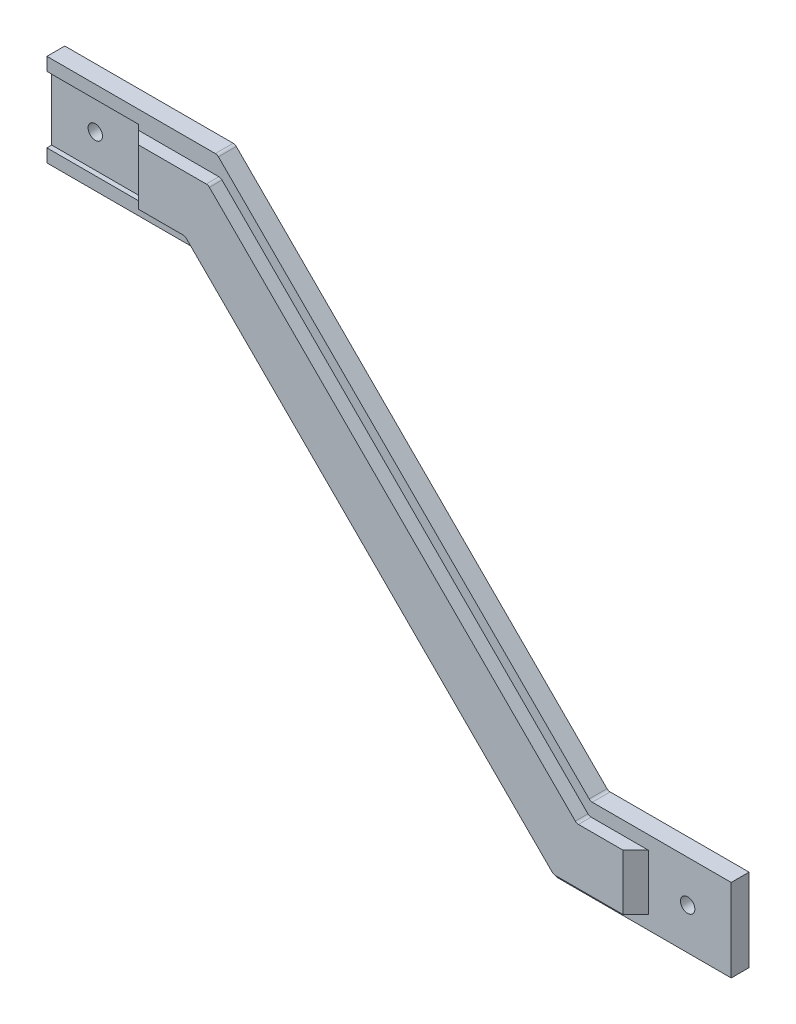
ISO-10303-21;
HEADER;
FILE_DESCRIPTION(('STEP AP214'),'2;1');
FILE_NAME('part.step','',(''),(''),'','','');
FILE_SCHEMA(('AUTOMOTIVE_DESIGN { 1 0 10303 214 1 1 1 1 }'));
ENDSEC;
DATA;
#1=APPLICATION_CONTEXT('core data for automotive mechanical design processes');
#2=APPLICATION_PROTOCOL_DEFINITION('international standard','automotive_design',2000,#1);
#3=PRODUCT_CONTEXT('',#1,'mechanical');
#4=PRODUCT('Part','Part','',(#3));
#5=PRODUCT_RELATED_PRODUCT_CATEGORY('part','',(#4));
#6=PRODUCT_DEFINITION_FORMATION('','',#4);
#7=PRODUCT_DEFINITION_CONTEXT('part definition',#1,'design');
#8=PRODUCT_DEFINITION('design','',#6,#7);
#9=PRODUCT_DEFINITION_SHAPE('','',#8);
#10=(LENGTH_UNIT() NAMED_UNIT(*) SI_UNIT(.MILLI.,.METRE.));
#11=(NAMED_UNIT(*) PLANE_ANGLE_UNIT() SI_UNIT($,.RADIAN.));
#12=(NAMED_UNIT(*) SI_UNIT($,.STERADIAN.) SOLID_ANGLE_UNIT());
#13=UNCERTAINTY_MEASURE_WITH_UNIT(LENGTH_MEASURE(1.E-05),#10,'distance_accuracy_value','');
#14=(GEOMETRIC_REPRESENTATION_CONTEXT(3) GLOBAL_UNCERTAINTY_ASSIGNED_CONTEXT((#13)) GLOBAL_UNIT_ASSIGNED_CONTEXT((#10,
#11,#12)) REPRESENTATION_CONTEXT('',''));
#15=CARTESIAN_POINT('',(0.,0.,0.));
#16=DIRECTION('',(0.,0.,1.));
#17=DIRECTION('',(1.,0.,0.));
#18=AXIS2_PLACEMENT_3D('',#15,#16,#17);
#19=CARTESIAN_POINT('',(-68.55,42.3,3.));
#20=DIRECTION('',(0.,0.,-1.));
#21=DIRECTION('',(-1.,0.,0.));
#22=AXIS2_PLACEMENT_3D('',#19,#20,#21);
#23=CYLINDRICAL_SURFACE('',#22,1.65);
#24=CARTESIAN_POINT('',(-68.55,42.3,-1.1));
#25=DIRECTION('',(0.,0.,1.));
#26=DIRECTION('',(1.,0.,0.));
#27=AXIS2_PLACEMENT_3D('',#24,#25,#26);
#28=CIRCLE('',#27,1.65);
#29=CARTESIAN_POINT('',(-66.9,42.3,-1.1));
#30=VERTEX_POINT('',#29);
#31=EDGE_CURVE('E266',#30,#30,#28,.T.);
#32=ORIENTED_EDGE('',*,*,#31,.F.);
#33=EDGE_LOOP('',(#32));
#34=FACE_BOUND('',#33,.T.);
#35=CARTESIAN_POINT('',(-68.55,42.3,1.9));
#36=DIRECTION('',(0.,0.,1.));
#37=DIRECTION('',(1.,0.,0.));
#38=AXIS2_PLACEMENT_3D('',#35,#36,#37);
#39=CIRCLE('',#38,1.65);
#40=CARTESIAN_POINT('',(-66.9,42.3,1.9));
#41=VERTEX_POINT('',#40);
#42=EDGE_CURVE('E259',#41,#41,#39,.T.);
#43=ORIENTED_EDGE('',*,*,#42,.T.);
#44=EDGE_LOOP('',(#43));
#45=FACE_BOUND('',#44,.T.);
#46=ADVANCED_FACE('F36',(#34,#45),#23,.F.);
#47=CARTESIAN_POINT('',(0.,0.,3.));
#48=DIRECTION('',(0.,0.,-1.));
#49=DIRECTION('',(-1.,0.,0.));
#50=AXIS2_PLACEMENT_3D('',#47,#48,#49);
#51=PLANE('',#50);
#52=CARTESIAN_POINT('',(68.55,-42.3,3.));
#53=DIRECTION('',(0.,0.,1.));
#54=DIRECTION('',(1.,0.,0.));
#55=AXIS2_PLACEMENT_3D('',#52,#53,#54);
#56=CIRCLE('',#55,1.65);
#57=CARTESIAN_POINT('',(70.2,-42.3,3.));
#58=VERTEX_POINT('',#57);
#59=EDGE_CURVE('E318',#58,#58,#56,.T.);
#60=ORIENTED_EDGE('',*,*,#59,.F.);
#61=EDGE_LOOP('',(#60));
#62=FACE_BOUND('',#61,.T.);
#63=DIRECTION('',(-0.707106781186546,0.707106781186549,0.));
#64=VECTOR('',#63,1.);
#65=CARTESIAN_POINT('',(-38.3649711574555,51.8,3.));
#66=LINE('',#65,#64);
#67=CARTESIAN_POINT('',(45.9421356237309,-32.5071067811866,3.));
#68=VERTEX_POINT('',#67);
#69=CARTESIAN_POINT('',(-39.1720779386421,52.6071067811866,3.));
#70=VERTEX_POINT('',#69);
#71=EDGE_CURVE('E354',#68,#70,#66,.T.);
#72=ORIENTED_EDGE('',*,*,#71,.T.);
#73=CARTESIAN_POINT('',(-39.8791847198286,51.9,3.));
#74=DIRECTION('',(0.,0.,-1.));
#75=DIRECTION('',(-1.,0.,0.));
#76=AXIS2_PLACEMENT_3D('',#73,#74,#75);
#77=CIRCLE('',#76,1.);
#78=CARTESIAN_POINT('',(-39.8791847198286,52.9,3.));
#79=VERTEX_POINT('',#78);
#80=EDGE_CURVE('E405',#70,#79,#77,.F.);
#81=ORIENTED_EDGE('',*,*,#80,.T.);
#82=DIRECTION('',(-1.,0.,0.));
#83=VECTOR('',#82,1.);
#84=CARTESIAN_POINT('',(-39.4649711574558,52.9,3.));
#85=LINE('',#84,#83);
#86=CARTESIAN_POINT('',(-78.55,52.9,3.));
#87=VERTEX_POINT('',#86);
#88=EDGE_CURVE('E269',#79,#87,#85,.T.);
#89=ORIENTED_EDGE('',*,*,#88,.T.);
#90=DIRECTION('',(0.,-1.,0.));
#91=VECTOR('',#90,1.);
#92=CARTESIAN_POINT('',(-78.55,32.8,3.));
#93=LINE('',#92,#91);
#94=CARTESIAN_POINT('',(-78.55,49.9,3.));
#95=VERTEX_POINT('',#94);
#96=EDGE_CURVE('E342',#87,#95,#93,.T.);
#97=ORIENTED_EDGE('',*,*,#96,.T.);
#98=DIRECTION('',(-1.,0.,0.));
#99=VECTOR('',#98,1.);
#100=CARTESIAN_POINT('',(-57.55,49.9,3.));
#101=LINE('',#100,#99);
#102=CARTESIAN_POINT('',(-57.55,49.9,3.));
#103=VERTEX_POINT('',#102);
#104=EDGE_CURVE('E227',#103,#95,#101,.T.);
#105=ORIENTED_EDGE('',*,*,#104,.F.);
#106=DIRECTION('',(0.,1.,0.));
#107=VECTOR('',#106,1.);
#108=CARTESIAN_POINT('',(-57.55,34.7,3.));
#109=LINE('',#108,#107);
#110=CARTESIAN_POINT('',(-57.55,48.7,3.));
#111=VERTEX_POINT('',#110);
#112=EDGE_CURVE('E255',#111,#103,#109,.T.);
#113=ORIENTED_EDGE('',*,*,#112,.F.);
#114=DIRECTION('',(-1.,0.,0.));
#115=VECTOR('',#114,1.);
#116=CARTESIAN_POINT('',(-38.6490332008122,48.7,3.));
#117=LINE('',#116,#115);
#118=CARTESIAN_POINT('',(-39.0632467631852,48.7,3.));
#119=VERTEX_POINT('',#118);
#120=EDGE_CURVE('E298',#119,#111,#117,.T.);
#121=ORIENTED_EDGE('',*,*,#120,.F.);
#122=CARTESIAN_POINT('',(-39.0632467631852,47.7,3.));
#123=DIRECTION('',(0.,0.,-1.));
#124=DIRECTION('',(-1.,0.,0.));
#125=AXIS2_PLACEMENT_3D('',#122,#123,#124);
#126=CIRCLE('',#125,1.);
#127=CARTESIAN_POINT('',(-38.3561399819987,48.4071067811866,3.));
#128=VERTEX_POINT('',#127);
#129=EDGE_CURVE('E436',#119,#128,#126,.T.);
#130=ORIENTED_EDGE('',*,*,#129,.T.);
#131=DIRECTION('',(-0.707106781186548,0.707106781186548,0.));
#132=VECTOR('',#131,1.);
#133=CARTESIAN_POINT('',(45.9509667991878,-35.9,3.));
#134=LINE('',#133,#132);
#135=CARTESIAN_POINT('',(45.6580735803744,-35.6071067811865,3.));
#136=VERTEX_POINT('',#135);
#137=EDGE_CURVE('E304',#136,#128,#134,.T.);
#138=ORIENTED_EDGE('',*,*,#137,.F.);
#139=CARTESIAN_POINT('',(46.3651803615609,-34.9,3.));
#140=DIRECTION('',(0.,0.,-1.));
#141=DIRECTION('',(-1.,0.,0.));
#142=AXIS2_PLACEMENT_3D('',#139,#140,#141);
#143=CIRCLE('',#142,1.);
#144=CARTESIAN_POINT('',(46.3651803615609,-35.9,3.));
#145=VERTEX_POINT('',#144);
#146=EDGE_CURVE('E403',#136,#145,#143,.F.);
#147=ORIENTED_EDGE('',*,*,#146,.T.);
#148=DIRECTION('',(-1.,0.,0.));
#149=VECTOR('',#148,1.);
#150=CARTESIAN_POINT('',(59.55,-35.9,3.));
#151=LINE('',#150,#149);
#152=CARTESIAN_POINT('',(59.55,-35.9,3.));
#153=VERTEX_POINT('',#152);
#154=EDGE_CURVE('E334',#153,#145,#151,.T.);
#155=ORIENTED_EDGE('',*,*,#154,.F.);
#156=DIRECTION('',(0.,1.,0.));
#157=VECTOR('',#156,1.);
#158=CARTESIAN_POINT('',(59.55,-48.7,3.));
#159=LINE('',#158,#157);
#160=CARTESIAN_POINT('',(59.55,-48.7,3.));
#161=VERTEX_POINT('',#160);
#162=EDGE_CURVE('E331',#161,#153,#159,.T.);
#163=ORIENTED_EDGE('',*,*,#162,.F.);
#164=DIRECTION('',(1.,0.,0.));
#165=VECTOR('',#164,1.);
#166=CARTESIAN_POINT('',(40.6490332008122,-48.7,3.));
#167=LINE('',#166,#165);
#168=CARTESIAN_POINT('',(41.0632467631853,-48.7,3.));
#169=VERTEX_POINT('',#168);
#170=EDGE_CURVE('E329',#169,#161,#167,.T.);
#171=ORIENTED_EDGE('',*,*,#170,.F.);
#172=CARTESIAN_POINT('',(41.0632467631853,-47.7,3.));
#173=DIRECTION('',(0.,0.,-1.));
#174=DIRECTION('',(-1.,0.,0.));
#175=AXIS2_PLACEMENT_3D('',#172,#173,#174);
#176=CIRCLE('',#175,1.);
#177=CARTESIAN_POINT('',(40.3561399819987,-48.4071067811865,3.));
#178=VERTEX_POINT('',#177);
#179=EDGE_CURVE('E444',#169,#178,#176,.T.);
#180=ORIENTED_EDGE('',*,*,#179,.T.);
#181=DIRECTION('',(0.707106781186547,-0.707106781186548,0.));
#182=VECTOR('',#181,1.);
#183=CARTESIAN_POINT('',(-43.9509667991878,35.9,3.));
#184=LINE('',#183,#182);
#185=CARTESIAN_POINT('',(-43.6580735803743,35.6071067811866,3.));
#186=VERTEX_POINT('',#185);
#187=EDGE_CURVE('E326',#186,#178,#184,.T.);
#188=ORIENTED_EDGE('',*,*,#187,.F.);
#189=CARTESIAN_POINT('',(-44.3651803615609,34.9,3.));
#190=DIRECTION('',(0.,0.,-1.));
#191=DIRECTION('',(-1.,0.,0.));
#192=AXIS2_PLACEMENT_3D('',#189,#190,#191);
#193=CIRCLE('',#192,1.);
#194=CARTESIAN_POINT('',(-44.3651803615609,35.9,3.));
#195=VERTEX_POINT('',#194);
#196=EDGE_CURVE('E399',#186,#195,#193,.F.);
#197=ORIENTED_EDGE('',*,*,#196,.T.);
#198=DIRECTION('',(1.,0.,0.));
#199=VECTOR('',#198,1.);
#200=CARTESIAN_POINT('',(-57.55,35.9,3.));
#201=LINE('',#200,#199);
#202=CARTESIAN_POINT('',(-57.55,35.9,3.));
#203=VERTEX_POINT('',#202);
#204=EDGE_CURVE('E323',#203,#195,#201,.T.);
#205=ORIENTED_EDGE('',*,*,#204,.F.);
#206=CARTESIAN_POINT('',(-57.55,34.7,3.));
#207=VERTEX_POINT('',#206);
#208=EDGE_CURVE('E242',#207,#203,#109,.T.);
#209=ORIENTED_EDGE('',*,*,#208,.F.);
#210=DIRECTION('',(1.,0.,0.));
#211=VECTOR('',#210,1.);
#212=CARTESIAN_POINT('',(-78.55,34.7,3.));
#213=LINE('',#212,#211);
#214=CARTESIAN_POINT('',(-78.55,34.7,3.));
#215=VERTEX_POINT('',#214);
#216=EDGE_CURVE('E252',#215,#207,#213,.T.);
#217=ORIENTED_EDGE('',*,*,#216,.F.);
#218=CARTESIAN_POINT('',(-78.55,31.7,3.));
#219=VERTEX_POINT('',#218);
#220=EDGE_CURVE('E341',#215,#219,#93,.T.);
#221=ORIENTED_EDGE('',*,*,#220,.T.);
#222=DIRECTION('',(1.,0.,0.));
#223=VECTOR('',#222,1.);
#224=CARTESIAN_POINT('',(-78.55,31.7,3.));
#225=LINE('',#224,#223);
#226=CARTESIAN_POINT('',(-45.5492424049174,31.7,3.));
#227=VERTEX_POINT('',#226);
#228=EDGE_CURVE('E273',#219,#227,#225,.T.);
#229=ORIENTED_EDGE('',*,*,#228,.T.);
#230=CARTESIAN_POINT('',(-45.5492424049174,30.7,3.));
#231=DIRECTION('',(0.,0.,-1.));
#232=DIRECTION('',(-1.,0.,0.));
#233=AXIS2_PLACEMENT_3D('',#230,#231,#232);
#234=CIRCLE('',#233,1.);
#235=CARTESIAN_POINT('',(-44.8421356237309,31.4071067811865,3.));
#236=VERTEX_POINT('',#235);
#237=EDGE_CURVE('E44',#227,#236,#234,.T.);
#238=ORIENTED_EDGE('',*,*,#237,.T.);
#239=DIRECTION('',(0.707106781186547,-0.707106781186548,0.));
#240=VECTOR('',#239,1.);
#241=CARTESIAN_POINT('',(38.3649711574555,-51.8,3.));
#242=LINE('',#241,#240);
#243=CARTESIAN_POINT('',(38.072077938642,-51.5071067811865,3.));
#244=VERTEX_POINT('',#243);
#245=EDGE_CURVE('E344',#236,#244,#242,.T.);
#246=ORIENTED_EDGE('',*,*,#245,.T.);
#247=CARTESIAN_POINT('',(38.7791847198286,-50.8,3.));
#248=DIRECTION('',(0.,0.,-1.));
#249=DIRECTION('',(-1.,0.,0.));
#250=AXIS2_PLACEMENT_3D('',#247,#248,#249);
#251=CIRCLE('',#250,1.);
#252=CARTESIAN_POINT('',(38.7791847198286,-51.8,3.));
#253=VERTEX_POINT('',#252);
#254=EDGE_CURVE('E401',#244,#253,#251,.F.);
#255=ORIENTED_EDGE('',*,*,#254,.T.);
#256=DIRECTION('',(1.,0.,0.));
#257=VECTOR('',#256,1.);
#258=CARTESIAN_POINT('',(78.55,-51.8,3.));
#259=LINE('',#258,#257);
#260=CARTESIAN_POINT('',(78.55,-51.8,3.));
#261=VERTEX_POINT('',#260);
#262=EDGE_CURVE('E347',#253,#261,#259,.T.);
#263=ORIENTED_EDGE('',*,*,#262,.T.);
#264=DIRECTION('',(0.,1.,0.));
#265=VECTOR('',#264,1.);
#266=CARTESIAN_POINT('',(78.55,-32.8000000000001,3.));
#267=LINE('',#266,#265);
#268=CARTESIAN_POINT('',(78.55,-32.8000000000001,3.));
#269=VERTEX_POINT('',#268);
#270=EDGE_CURVE('E349',#261,#269,#267,.T.);
#271=ORIENTED_EDGE('',*,*,#270,.T.);
#272=DIRECTION('',(-1.,0.,0.));
#273=VECTOR('',#272,1.);
#274=CARTESIAN_POINT('',(46.2350288425443,-32.8000000000001,3.));
#275=LINE('',#274,#273);
#276=CARTESIAN_POINT('',(46.6492424049174,-32.8000000000001,3.));
#277=VERTEX_POINT('',#276);
#278=EDGE_CURVE('E351',#269,#277,#275,.T.);
#279=ORIENTED_EDGE('',*,*,#278,.T.);
#280=CARTESIAN_POINT('',(46.6492424049174,-31.8000000000001,3.));
#281=DIRECTION('',(0.,0.,-1.));
#282=DIRECTION('',(-1.,0.,0.));
#283=AXIS2_PLACEMENT_3D('',#280,#281,#282);
#284=CIRCLE('',#283,1.);
#285=EDGE_CURVE('E440',#277,#68,#284,.T.);
#286=ORIENTED_EDGE('',*,*,#285,.T.);
#287=EDGE_LOOP('',(#72,#81,#89,#97,#105,#113,#121,#130,#138,#147,#155,#163,#171,#180,#188,#197,
#205,#209,#217,#221,#229,#238,#246,#255,#263,#271,#279,#286));
#288=FACE_BOUND('',#287,.T.);
#289=ADVANCED_FACE('F449',(#62,#288),#51,.F.);
#290=CARTESIAN_POINT('',(-78.55,32.8,3.));
#291=DIRECTION('',(1.,0.,0.));
#292=DIRECTION('',(0.,0.,-1.));
#293=AXIS2_PLACEMENT_3D('',#290,#291,#292);
#294=PLANE('',#293);
#295=DIRECTION('',(0.,-1.,0.));
#296=VECTOR('',#295,1.);
#297=CARTESIAN_POINT('',(-78.55,49.9,1.9));
#298=LINE('',#297,#296);
#299=CARTESIAN_POINT('',(-78.55,49.9,1.9));
#300=VERTEX_POINT('',#299);
#301=CARTESIAN_POINT('',(-78.55,34.7,1.9));
#302=VERTEX_POINT('',#301);
#303=EDGE_CURVE('E239',#300,#302,#298,.T.);
#304=ORIENTED_EDGE('',*,*,#303,.F.);
#305=DIRECTION('',(0.,0.,1.));
#306=VECTOR('',#305,1.);
#307=CARTESIAN_POINT('',(-78.55,49.9,1.9));
#308=LINE('',#307,#306);
#309=EDGE_CURVE('E220',#300,#95,#308,.T.);
#310=ORIENTED_EDGE('',*,*,#309,.T.);
#311=ORIENTED_EDGE('',*,*,#96,.F.);
#312=DIRECTION('',(0.,0.,1.));
#313=VECTOR('',#312,1.);
#314=CARTESIAN_POINT('',(-78.55,52.9,-1.1));
#315=LINE('',#314,#313);
#316=CARTESIAN_POINT('',(-78.55,52.9,-1.1));
#317=VERTEX_POINT('',#316);
#318=EDGE_CURVE('E291',#317,#87,#315,.T.);
#319=ORIENTED_EDGE('',*,*,#318,.F.);
#320=DIRECTION('',(0.,-1.,0.));
#321=VECTOR('',#320,1.);
#322=CARTESIAN_POINT('',(-78.55,52.9,-1.1));
#323=LINE('',#322,#321);
#324=CARTESIAN_POINT('',(-78.55,31.7,-1.1));
#325=VERTEX_POINT('',#324);
#326=EDGE_CURVE('E272',#317,#325,#323,.T.);
#327=ORIENTED_EDGE('',*,*,#326,.T.);
#328=DIRECTION('',(0.,0.,1.));
#329=VECTOR('',#328,1.);
#330=CARTESIAN_POINT('',(-78.55,31.7,-1.1));
#331=LINE('',#330,#329);
#332=EDGE_CURVE('E295',#325,#219,#331,.T.);
#333=ORIENTED_EDGE('',*,*,#332,.T.);
#334=ORIENTED_EDGE('',*,*,#220,.F.);
#335=DIRECTION('',(0.,0.,1.));
#336=VECTOR('',#335,1.);
#337=CARTESIAN_POINT('',(-78.55,34.7,1.9));
#338=LINE('',#337,#336);
#339=EDGE_CURVE('E232',#302,#215,#338,.T.);
#340=ORIENTED_EDGE('',*,*,#339,.F.);
#341=EDGE_LOOP('',(#304,#310,#311,#319,#327,#333,#334,#340));
#342=FACE_BOUND('',#341,.T.);
#343=ADVANCED_FACE('F244',(#342),#294,.F.);
#344=CARTESIAN_POINT('',(38.3649711574555,-51.8,3.));
#345=DIRECTION('',(0.707106781186548,0.707106781186547,0.));
#346=DIRECTION('',(-0.707106781186547,0.707106781186548,0.));
#347=AXIS2_PLACEMENT_3D('',#344,#345,#346);
#348=PLANE('',#347);
#349=DIRECTION('',(0.707106781186547,-0.707106781186548,0.));
#350=VECTOR('',#349,1.);
#351=CARTESIAN_POINT('',(-45.1350288425443,31.7,-1.1));
#352=LINE('',#351,#350);
#353=CARTESIAN_POINT('',(-44.8421356237309,31.4071067811865,-1.1));
#354=VERTEX_POINT('',#353);
#355=CARTESIAN_POINT('',(38.072077938642,-51.5071067811865,-1.1));
#356=VERTEX_POINT('',#355);
#357=EDGE_CURVE('E278',#354,#356,#352,.T.);
#358=ORIENTED_EDGE('',*,*,#357,.T.);
#359=DIRECTION('',(0.,0.,-1.));
#360=VECTOR('',#359,1.);
#361=CARTESIAN_POINT('',(38.072077938642,-51.5071067811865,3.));
#362=LINE('',#361,#360);
#363=EDGE_CURVE('E421',#356,#244,#362,.F.);
#364=ORIENTED_EDGE('',*,*,#363,.T.);
#365=ORIENTED_EDGE('',*,*,#245,.F.);
#366=DIRECTION('',(0.,0.,1.));
#367=VECTOR('',#366,1.);
#368=CARTESIAN_POINT('',(-44.8421356237308,31.4071067811865,3.));
#369=LINE('',#368,#367);
#370=EDGE_CURVE('E419',#236,#354,#369,.F.);
#371=ORIENTED_EDGE('',*,*,#370,.T.);
#372=EDGE_LOOP('',(#358,#364,#365,#371));
#373=FACE_BOUND('',#372,.T.);
#374=ADVANCED_FACE('F456',(#373),#348,.F.);
#375=CARTESIAN_POINT('',(78.55,-51.8,3.));
#376=DIRECTION('',(0.,1.,0.));
#377=DIRECTION('',(0.,0.,1.));
#378=AXIS2_PLACEMENT_3D('',#375,#376,#377);
#379=PLANE('',#378);
#380=ORIENTED_EDGE('',*,*,#262,.F.);
#381=DIRECTION('',(0.,0.,-1.));
#382=VECTOR('',#381,1.);
#383=CARTESIAN_POINT('',(38.7791847198286,-51.8,3.));
#384=LINE('',#383,#382);
#385=CARTESIAN_POINT('',(38.7791847198286,-51.8,-1.1));
#386=VERTEX_POINT('',#385);
#387=EDGE_CURVE('E416',#253,#386,#384,.T.);
#388=ORIENTED_EDGE('',*,*,#387,.T.);
#389=DIRECTION('',(1.,0.,0.));
#390=VECTOR('',#389,1.);
#391=CARTESIAN_POINT('',(38.3649711574555,-51.8,-1.1));
#392=LINE('',#391,#390);
#393=CARTESIAN_POINT('',(78.55,-51.8,-1.1));
#394=VERTEX_POINT('',#393);
#395=EDGE_CURVE('E280',#386,#394,#392,.T.);
#396=ORIENTED_EDGE('',*,*,#395,.T.);
#397=DIRECTION('',(0.,0.,-1.));
#398=VECTOR('',#397,1.);
#399=CARTESIAN_POINT('',(78.55,-51.8,3.));
#400=LINE('',#399,#398);
#401=EDGE_CURVE('E359',#261,#394,#400,.T.);
#402=ORIENTED_EDGE('',*,*,#401,.F.);
#403=EDGE_LOOP('',(#380,#388,#396,#402));
#404=FACE_BOUND('',#403,.T.);
#405=ADVANCED_FACE('F493',(#404),#379,.F.);
#406=CARTESIAN_POINT('',(78.55,-32.8000000000001,3.));
#407=DIRECTION('',(-1.,0.,0.));
#408=DIRECTION('',(0.,0.,1.));
#409=AXIS2_PLACEMENT_3D('',#406,#407,#408);
#410=PLANE('',#409);
#411=ORIENTED_EDGE('',*,*,#401,.T.);
#412=DIRECTION('',(0.,1.,0.));
#413=VECTOR('',#412,1.);
#414=CARTESIAN_POINT('',(78.55,-51.8,-1.1));
#415=LINE('',#414,#413);
#416=CARTESIAN_POINT('',(78.55,-32.8000000000001,-1.1));
#417=VERTEX_POINT('',#416);
#418=EDGE_CURVE('E282',#394,#417,#415,.T.);
#419=ORIENTED_EDGE('',*,*,#418,.T.);
#420=DIRECTION('',(0.,0.,-1.));
#421=VECTOR('',#420,1.);
#422=CARTESIAN_POINT('',(78.55,-32.8000000000001,3.));
#423=LINE('',#422,#421);
#424=EDGE_CURVE('E357',#269,#417,#423,.T.);
#425=ORIENTED_EDGE('',*,*,#424,.F.);
#426=ORIENTED_EDGE('',*,*,#270,.F.);
#427=EDGE_LOOP('',(#411,#419,#425,#426));
#428=FACE_BOUND('',#427,.T.);
#429=ADVANCED_FACE('F489',(#428),#410,.F.);
#430=CARTESIAN_POINT('',(46.2350288425443,-32.8000000000001,3.));
#431=DIRECTION('',(0.,-1.,0.));
#432=DIRECTION('',(0.,0.,-1.));
#433=AXIS2_PLACEMENT_3D('',#430,#431,#432);
#434=PLANE('',#433);
#435=DIRECTION('',(-1.,0.,0.));
#436=VECTOR('',#435,1.);
#437=CARTESIAN_POINT('',(78.55,-32.8000000000001,-1.1));
#438=LINE('',#437,#436);
#439=CARTESIAN_POINT('',(46.6492424049174,-32.8000000000001,-1.1));
#440=VERTEX_POINT('',#439);
#441=EDGE_CURVE('E285',#417,#440,#438,.T.);
#442=ORIENTED_EDGE('',*,*,#441,.T.);
#443=DIRECTION('',(0.,0.,-1.));
#444=VECTOR('',#443,1.);
#445=CARTESIAN_POINT('',(46.6492424049174,-32.8000000000001,3.));
#446=LINE('',#445,#444);
#447=EDGE_CURVE('E412',#440,#277,#446,.F.);
#448=ORIENTED_EDGE('',*,*,#447,.T.);
#449=ORIENTED_EDGE('',*,*,#278,.F.);
#450=ORIENTED_EDGE('',*,*,#424,.T.);
#451=EDGE_LOOP('',(#442,#448,#449,#450));
#452=FACE_BOUND('',#451,.T.);
#453=ADVANCED_FACE('F485',(#452),#434,.F.);
#454=CARTESIAN_POINT('',(-38.3649711574555,51.8,3.));
#455=DIRECTION('',(-0.707106781186549,-0.707106781186546,0.));
#456=DIRECTION('',(0.707106781186546,-0.707106781186549,0.));
#457=AXIS2_PLACEMENT_3D('',#454,#455,#456);
#458=PLANE('',#457);
#459=DIRECTION('',(-0.707106781186548,0.707106781186547,0.));
#460=VECTOR('',#459,1.);
#461=CARTESIAN_POINT('',(46.2350288425443,-32.8000000000001,-1.1));
#462=LINE('',#461,#460);
#463=CARTESIAN_POINT('',(45.9421356237309,-32.5071067811866,-1.1));
#464=VERTEX_POINT('',#463);
#465=CARTESIAN_POINT('',(-39.1720779386422,52.6071067811864,-1.1));
#466=VERTEX_POINT('',#465);
#467=EDGE_CURVE('E288',#464,#466,#462,.T.);
#468=ORIENTED_EDGE('',*,*,#467,.T.);
#469=DIRECTION('',(0.,0.,1.));
#470=VECTOR('',#469,1.);
#471=CARTESIAN_POINT('',(-39.1720779386421,52.6071067811866,3.));
#472=LINE('',#471,#470);
#473=EDGE_CURVE('E396',#466,#70,#472,.T.);
#474=ORIENTED_EDGE('',*,*,#473,.T.);
#475=ORIENTED_EDGE('',*,*,#71,.F.);
#476=DIRECTION('',(0.,0.,-1.));
#477=VECTOR('',#476,1.);
#478=CARTESIAN_POINT('',(45.9421356237309,-32.5071067811866,-1.1));
#479=LINE('',#478,#477);
#480=EDGE_CURVE('E393',#68,#464,#479,.T.);
#481=ORIENTED_EDGE('',*,*,#480,.T.);
#482=EDGE_LOOP('',(#468,#474,#475,#481));
#483=FACE_BOUND('',#482,.T.);
#484=ADVANCED_FACE('F475',(#483),#458,.F.);
#485=CARTESIAN_POINT('',(68.55,-42.3,3.));
#486=DIRECTION('',(0.,0.,-1.));
#487=DIRECTION('',(-1.,0.,0.));
#488=AXIS2_PLACEMENT_3D('',#485,#486,#487);
#489=CYLINDRICAL_SURFACE('',#488,1.65);
#490=ORIENTED_EDGE('',*,*,#59,.T.);
#491=EDGE_LOOP('',(#490));
#492=FACE_BOUND('',#491,.T.);
#493=CARTESIAN_POINT('',(68.55,-42.3,-1.1));
#494=DIRECTION('',(0.,0.,1.));
#495=DIRECTION('',(1.,0.,0.));
#496=AXIS2_PLACEMENT_3D('',#493,#494,#495);
#497=CIRCLE('',#496,1.65);
#498=CARTESIAN_POINT('',(70.2,-42.3,-1.1));
#499=VERTEX_POINT('',#498);
#500=EDGE_CURVE('E263',#499,#499,#497,.T.);
#501=ORIENTED_EDGE('',*,*,#500,.F.);
#502=EDGE_LOOP('',(#501));
#503=FACE_BOUND('',#502,.T.);
#504=ADVANCED_FACE('F521',(#492,#503),#489,.F.);
#505=CARTESIAN_POINT('',(-38.6490332008122,48.7,5.9));
#506=DIRECTION('',(0.,-1.,0.));
#507=DIRECTION('',(0.,0.,-1.));
#508=AXIS2_PLACEMENT_3D('',#505,#506,#507);
#509=PLANE('',#508);
#510=DIRECTION('',(-1.,0.,0.));
#511=VECTOR('',#510,1.);
#512=CARTESIAN_POINT('',(-38.6490332008122,48.7,5.9));
#513=LINE('',#512,#511);
#514=CARTESIAN_POINT('',(-39.0632467631852,48.7,5.9));
#515=VERTEX_POINT('',#514);
#516=CARTESIAN_POINT('',(-54.65,48.7,5.9));
#517=VERTEX_POINT('',#516);
#518=EDGE_CURVE('E301',#515,#517,#513,.T.);
#519=ORIENTED_EDGE('',*,*,#518,.F.);
#520=DIRECTION('',(0.,0.,-1.));
#521=VECTOR('',#520,1.);
#522=CARTESIAN_POINT('',(-39.0632467631852,48.7,5.9));
#523=LINE('',#522,#521);
#524=EDGE_CURVE('E379',#515,#119,#523,.T.);
#525=ORIENTED_EDGE('',*,*,#524,.T.);
#526=ORIENTED_EDGE('',*,*,#120,.T.);
#527=DIRECTION('',(0.707106781186548,0.,0.707106781186548));
#528=VECTOR('',#527,1.);
#529=CARTESIAN_POINT('',(-54.65,48.7,5.9));
#530=LINE('',#529,#528);
#531=EDGE_CURVE('E376',#111,#517,#530,.T.);
#532=ORIENTED_EDGE('',*,*,#531,.T.);
#533=EDGE_LOOP('',(#519,#525,#526,#532));
#534=FACE_BOUND('',#533,.T.);
#535=ADVANCED_FACE('F630',(#534),#509,.F.);
#536=CARTESIAN_POINT('',(-57.55,35.9,5.9));
#537=DIRECTION('',(0.,1.,0.));
#538=DIRECTION('',(0.,0.,1.));
#539=AXIS2_PLACEMENT_3D('',#536,#537,#538);
#540=PLANE('',#539);
#541=ORIENTED_EDGE('',*,*,#204,.T.);
#542=DIRECTION('',(0.,0.,-1.));
#543=VECTOR('',#542,1.);
#544=CARTESIAN_POINT('',(-44.3651803615609,35.9,5.9));
#545=LINE('',#544,#543);
#546=CARTESIAN_POINT('',(-44.3651803615609,35.9,5.9));
#547=VERTEX_POINT('',#546);
#548=EDGE_CURVE('E431',#195,#547,#545,.F.);
#549=ORIENTED_EDGE('',*,*,#548,.T.);
#550=DIRECTION('',(1.,0.,0.));
#551=VECTOR('',#550,1.);
#552=CARTESIAN_POINT('',(-57.55,35.9,5.9));
#553=LINE('',#552,#551);
#554=CARTESIAN_POINT('',(-54.65,35.9,5.9));
#555=VERTEX_POINT('',#554);
#556=EDGE_CURVE('E303',#555,#547,#553,.T.);
#557=ORIENTED_EDGE('',*,*,#556,.F.);
#558=DIRECTION('',(-0.707106781186548,0.,-0.707106781186548));
#559=VECTOR('',#558,1.);
#560=CARTESIAN_POINT('',(-54.65,35.9,5.9));
#561=LINE('',#560,#559);
#562=EDGE_CURVE('E373',#555,#203,#561,.T.);
#563=ORIENTED_EDGE('',*,*,#562,.T.);
#564=EDGE_LOOP('',(#541,#549,#557,#563));
#565=FACE_BOUND('',#564,.T.);
#566=ADVANCED_FACE('F636',(#565),#540,.F.);
#567=CARTESIAN_POINT('',(-43.9509667991878,35.9,5.9));
#568=DIRECTION('',(0.707106781186548,0.707106781186547,0.));
#569=DIRECTION('',(-0.707106781186547,0.707106781186548,0.));
#570=AXIS2_PLACEMENT_3D('',#567,#568,#569);
#571=PLANE('',#570);
#572=ORIENTED_EDGE('',*,*,#187,.T.);
#573=DIRECTION('',(0.,0.,-1.));
#574=VECTOR('',#573,1.);
#575=CARTESIAN_POINT('',(40.3561399819987,-48.4071067811865,5.9));
#576=LINE('',#575,#574);
#577=CARTESIAN_POINT('',(40.3561399819987,-48.4071067811865,5.9));
#578=VERTEX_POINT('',#577);
#579=EDGE_CURVE('E429',#178,#578,#576,.F.);
#580=ORIENTED_EDGE('',*,*,#579,.T.);
#581=DIRECTION('',(0.707106781186547,-0.707106781186548,0.));
#582=VECTOR('',#581,1.);
#583=CARTESIAN_POINT('',(-43.9509667991878,35.9,5.9));
#584=LINE('',#583,#582);
#585=CARTESIAN_POINT('',(-43.6580735803743,35.6071067811866,5.9));
#586=VERTEX_POINT('',#585);
#587=EDGE_CURVE('E307',#586,#578,#584,.T.);
#588=ORIENTED_EDGE('',*,*,#587,.F.);
#589=DIRECTION('',(0.,0.,-1.));
#590=VECTOR('',#589,1.);
#591=CARTESIAN_POINT('',(-43.6580735803743,35.6071067811866,3.));
#592=LINE('',#591,#590);
#593=EDGE_CURVE('E426',#586,#186,#592,.T.);
#594=ORIENTED_EDGE('',*,*,#593,.T.);
#595=EDGE_LOOP('',(#572,#580,#588,#594));
#596=FACE_BOUND('',#595,.T.);
#597=ADVANCED_FACE('F603',(#596),#571,.F.);
#598=CARTESIAN_POINT('',(40.6490332008122,-48.7,5.9));
#599=DIRECTION('',(0.,1.,0.));
#600=DIRECTION('',(0.,0.,1.));
#601=AXIS2_PLACEMENT_3D('',#598,#599,#600);
#602=PLANE('',#601);
#603=DIRECTION('',(1.,0.,0.));
#604=VECTOR('',#603,1.);
#605=CARTESIAN_POINT('',(40.6490332008122,-48.7,5.9));
#606=LINE('',#605,#604);
#607=CARTESIAN_POINT('',(41.0632467631853,-48.7,5.9));
#608=VERTEX_POINT('',#607);
#609=CARTESIAN_POINT('',(56.65,-48.7,5.9));
#610=VERTEX_POINT('',#609);
#611=EDGE_CURVE('E310',#608,#610,#606,.T.);
#612=ORIENTED_EDGE('',*,*,#611,.F.);
#613=DIRECTION('',(0.,0.,-1.));
#614=VECTOR('',#613,1.);
#615=CARTESIAN_POINT('',(41.0632467631853,-48.7,5.9));
#616=LINE('',#615,#614);
#617=EDGE_CURVE('E423',#608,#169,#616,.T.);
#618=ORIENTED_EDGE('',*,*,#617,.T.);
#619=ORIENTED_EDGE('',*,*,#170,.T.);
#620=DIRECTION('',(-0.707106781186548,0.,0.707106781186548));
#621=VECTOR('',#620,1.);
#622=CARTESIAN_POINT('',(56.65,-48.7,5.9));
#623=LINE('',#622,#621);
#624=EDGE_CURVE('E370',#161,#610,#623,.T.);
#625=ORIENTED_EDGE('',*,*,#624,.T.);
#626=EDGE_LOOP('',(#612,#618,#619,#625));
#627=FACE_BOUND('',#626,.T.);
#628=ADVANCED_FACE('F609',(#627),#602,.F.);
#629=CARTESIAN_POINT('',(59.55,-35.9,5.9));
#630=DIRECTION('',(0.,-1.,0.));
#631=DIRECTION('',(0.,0.,-1.));
#632=AXIS2_PLACEMENT_3D('',#629,#630,#631);
#633=PLANE('',#632);
#634=ORIENTED_EDGE('',*,*,#154,.T.);
#635=DIRECTION('',(0.,0.,-1.));
#636=VECTOR('',#635,1.);
#637=CARTESIAN_POINT('',(46.3651803615609,-35.9,5.9));
#638=LINE('',#637,#636);
#639=CARTESIAN_POINT('',(46.3651803615609,-35.9,5.9));
#640=VERTEX_POINT('',#639);
#641=EDGE_CURVE('E414',#145,#640,#638,.F.);
#642=ORIENTED_EDGE('',*,*,#641,.T.);
#643=DIRECTION('',(-1.,0.,0.));
#644=VECTOR('',#643,1.);
#645=CARTESIAN_POINT('',(59.55,-35.9,5.9));
#646=LINE('',#645,#644);
#647=CARTESIAN_POINT('',(56.65,-35.9,5.9));
#648=VERTEX_POINT('',#647);
#649=EDGE_CURVE('E312',#648,#640,#646,.T.);
#650=ORIENTED_EDGE('',*,*,#649,.F.);
#651=DIRECTION('',(0.707106781186548,0.,-0.707106781186548));
#652=VECTOR('',#651,1.);
#653=CARTESIAN_POINT('',(56.65,-35.9,5.9));
#654=LINE('',#653,#652);
#655=EDGE_CURVE('E368',#648,#153,#654,.T.);
#656=ORIENTED_EDGE('',*,*,#655,.T.);
#657=EDGE_LOOP('',(#634,#642,#650,#656));
#658=FACE_BOUND('',#657,.T.);
#659=ADVANCED_FACE('F617',(#658),#633,.F.);
#660=CARTESIAN_POINT('',(45.9509667991878,-35.9,5.9));
#661=DIRECTION('',(-0.707106781186547,-0.707106781186547,0.));
#662=DIRECTION('',(0.707106781186548,-0.707106781186548,0.));
#663=AXIS2_PLACEMENT_3D('',#660,#661,#662);
#664=PLANE('',#663);
#665=ORIENTED_EDGE('',*,*,#137,.T.);
#666=DIRECTION('',(0.,0.,-1.));
#667=VECTOR('',#666,1.);
#668=CARTESIAN_POINT('',(-38.3561399819987,48.4071067811865,5.9));
#669=LINE('',#668,#667);
#670=CARTESIAN_POINT('',(-38.3561399819987,48.4071067811866,5.9));
#671=VERTEX_POINT('',#670);
#672=EDGE_CURVE('E387',#128,#671,#669,.F.);
#673=ORIENTED_EDGE('',*,*,#672,.T.);
#674=DIRECTION('',(-0.707106781186548,0.707106781186548,0.));
#675=VECTOR('',#674,1.);
#676=CARTESIAN_POINT('',(45.9509667991878,-35.9,5.9));
#677=LINE('',#676,#675);
#678=CARTESIAN_POINT('',(45.6580735803744,-35.6071067811865,5.9));
#679=VERTEX_POINT('',#678);
#680=EDGE_CURVE('E315',#679,#671,#677,.T.);
#681=ORIENTED_EDGE('',*,*,#680,.F.);
#682=DIRECTION('',(0.,0.,-1.));
#683=VECTOR('',#682,1.);
#684=CARTESIAN_POINT('',(45.6580735803744,-35.6071067811865,3.));
#685=LINE('',#684,#683);
#686=EDGE_CURVE('E384',#679,#136,#685,.T.);
#687=ORIENTED_EDGE('',*,*,#686,.T.);
#688=EDGE_LOOP('',(#665,#673,#681,#687));
#689=FACE_BOUND('',#688,.T.);
#690=ADVANCED_FACE('F624',(#689),#664,.F.);
#691=CARTESIAN_POINT('',(0.,0.,5.9));
#692=DIRECTION('',(0.,0.,1.));
#693=DIRECTION('',(1.,0.,0.));
#694=AXIS2_PLACEMENT_3D('',#691,#692,#693);
#695=PLANE('',#694);
#696=ORIENTED_EDGE('',*,*,#680,.T.);
#697=CARTESIAN_POINT('',(-39.0632467631852,47.7,5.9));
#698=DIRECTION('',(0.,0.,1.));
#699=DIRECTION('',(1.,0.,0.));
#700=AXIS2_PLACEMENT_3D('',#697,#698,#699);
#701=CIRCLE('',#700,1.);
#702=EDGE_CURVE('E391',#671,#515,#701,.T.);
#703=ORIENTED_EDGE('',*,*,#702,.T.);
#704=ORIENTED_EDGE('',*,*,#518,.T.);
#705=DIRECTION('',(0.,-1.,0.));
#706=VECTOR('',#705,1.);
#707=CARTESIAN_POINT('',(-54.65,35.9,5.9));
#708=LINE('',#707,#706);
#709=EDGE_CURVE('E362',#517,#555,#708,.T.);
#710=ORIENTED_EDGE('',*,*,#709,.T.);
#711=ORIENTED_EDGE('',*,*,#556,.T.);
#712=CARTESIAN_POINT('',(-44.3651803615609,34.9,5.9));
#713=DIRECTION('',(0.,0.,1.));
#714=DIRECTION('',(1.,0.,0.));
#715=AXIS2_PLACEMENT_3D('',#712,#713,#714);
#716=CIRCLE('',#715,1.);
#717=EDGE_CURVE('E446',#547,#586,#716,.F.);
#718=ORIENTED_EDGE('',*,*,#717,.T.);
#719=ORIENTED_EDGE('',*,*,#587,.T.);
#720=CARTESIAN_POINT('',(41.0632467631853,-47.7,5.9));
#721=DIRECTION('',(0.,0.,1.));
#722=DIRECTION('',(1.,0.,0.));
#723=AXIS2_PLACEMENT_3D('',#720,#721,#722);
#724=CIRCLE('',#723,1.);
#725=EDGE_CURVE('E389',#578,#608,#724,.T.);
#726=ORIENTED_EDGE('',*,*,#725,.T.);
#727=ORIENTED_EDGE('',*,*,#611,.T.);
#728=DIRECTION('',(0.,1.,0.));
#729=VECTOR('',#728,1.);
#730=CARTESIAN_POINT('',(56.65,-35.9,5.9));
#731=LINE('',#730,#729);
#732=EDGE_CURVE('E365',#610,#648,#731,.T.);
#733=ORIENTED_EDGE('',*,*,#732,.T.);
#734=ORIENTED_EDGE('',*,*,#649,.T.);
#735=CARTESIAN_POINT('',(46.3651803615609,-34.9,5.9));
#736=DIRECTION('',(0.,0.,1.));
#737=DIRECTION('',(1.,0.,0.));
#738=AXIS2_PLACEMENT_3D('',#735,#736,#737);
#739=CIRCLE('',#738,1.);
#740=EDGE_CURVE('E442',#640,#679,#739,.F.);
#741=ORIENTED_EDGE('',*,*,#740,.T.);
#742=EDGE_LOOP('',(#696,#703,#704,#710,#711,#718,#719,#726,#727,#733,#734,#741));
#743=FACE_BOUND('',#742,.T.);
#744=ADVANCED_FACE('F544',(#743),#695,.T.);
#745=CARTESIAN_POINT('',(56.65,0.,5.9));
#746=DIRECTION('',(0.707106781186548,0.,0.707106781186548));
#747=DIRECTION('',(0.,-1.,0.));
#748=AXIS2_PLACEMENT_3D('',#745,#746,#747);
#749=PLANE('',#748);
#750=ORIENTED_EDGE('',*,*,#624,.F.);
#751=ORIENTED_EDGE('',*,*,#162,.T.);
#752=ORIENTED_EDGE('',*,*,#655,.F.);
#753=ORIENTED_EDGE('',*,*,#732,.F.);
#754=EDGE_LOOP('',(#750,#751,#752,#753));
#755=FACE_BOUND('',#754,.T.);
#756=ADVANCED_FACE('F537',(#755),#749,.T.);
#757=CARTESIAN_POINT('',(-54.65,0.,5.9));
#758=DIRECTION('',(-0.707106781186548,0.,0.707106781186548));
#759=DIRECTION('',(0.,1.,0.));
#760=AXIS2_PLACEMENT_3D('',#757,#758,#759);
#761=PLANE('',#760);
#762=ORIENTED_EDGE('',*,*,#531,.F.);
#763=DIRECTION('',(0.,-1.,0.));
#764=VECTOR('',#763,1.);
#765=CARTESIAN_POINT('',(-57.55,48.7,3.));
#766=LINE('',#765,#764);
#767=EDGE_CURVE('E320',#111,#203,#766,.T.);
#768=ORIENTED_EDGE('',*,*,#767,.T.);
#769=ORIENTED_EDGE('',*,*,#562,.F.);
#770=ORIENTED_EDGE('',*,*,#709,.F.);
#771=EDGE_LOOP('',(#762,#768,#769,#770));
#772=FACE_BOUND('',#771,.T.);
#773=ADVANCED_FACE('F543',(#772),#761,.T.);
#774=CARTESIAN_POINT('',(-39.4649711574558,52.9,-1.1));
#775=DIRECTION('',(0.,1.,0.));
#776=DIRECTION('',(-1.,0.,0.));
#777=AXIS2_PLACEMENT_3D('',#774,#775,#776);
#778=PLANE('',#777);
#779=ORIENTED_EDGE('',*,*,#88,.F.);
#780=DIRECTION('',(0.,0.,1.));
#781=VECTOR('',#780,1.);
#782=CARTESIAN_POINT('',(-39.8791847198286,52.9,-1.1));
#783=LINE('',#782,#781);
#784=CARTESIAN_POINT('',(-39.8791847198286,52.9,-1.1));
#785=VERTEX_POINT('',#784);
#786=EDGE_CURVE('E407',#79,#785,#783,.F.);
#787=ORIENTED_EDGE('',*,*,#786,.T.);
#788=DIRECTION('',(-1.,0.,0.));
#789=VECTOR('',#788,1.);
#790=CARTESIAN_POINT('',(-39.4649711574558,52.9,-1.1));
#791=LINE('',#790,#789);
#792=EDGE_CURVE('E270',#785,#317,#791,.T.);
#793=ORIENTED_EDGE('',*,*,#792,.T.);
#794=ORIENTED_EDGE('',*,*,#318,.T.);
#795=EDGE_LOOP('',(#779,#787,#793,#794));
#796=FACE_BOUND('',#795,.T.);
#797=ADVANCED_FACE('F466',(#796),#778,.T.);
#798=CARTESIAN_POINT('',(-78.55,31.7,-1.1));
#799=DIRECTION('',(0.,-1.,0.));
#800=DIRECTION('',(0.,0.,-1.));
#801=AXIS2_PLACEMENT_3D('',#798,#799,#800);
#802=PLANE('',#801);
#803=DIRECTION('',(1.,0.,0.));
#804=VECTOR('',#803,1.);
#805=CARTESIAN_POINT('',(-78.55,31.7,-1.1));
#806=LINE('',#805,#804);
#807=CARTESIAN_POINT('',(-45.5492424049174,31.7,-1.1));
#808=VERTEX_POINT('',#807);
#809=EDGE_CURVE('E276',#325,#808,#806,.T.);
#810=ORIENTED_EDGE('',*,*,#809,.T.);
#811=DIRECTION('',(0.,0.,1.));
#812=VECTOR('',#811,1.);
#813=CARTESIAN_POINT('',(-45.5492424049174,31.7,-1.1));
#814=LINE('',#813,#812);
#815=EDGE_CURVE('E433',#808,#227,#814,.T.);
#816=ORIENTED_EDGE('',*,*,#815,.T.);
#817=ORIENTED_EDGE('',*,*,#228,.F.);
#818=ORIENTED_EDGE('',*,*,#332,.F.);
#819=EDGE_LOOP('',(#810,#816,#817,#818));
#820=FACE_BOUND('',#819,.T.);
#821=ADVANCED_FACE('F459',(#820),#802,.T.);
#822=CARTESIAN_POINT('',(0.,0.,-1.1));
#823=DIRECTION('',(0.,0.,1.));
#824=DIRECTION('',(1.,0.,0.));
#825=AXIS2_PLACEMENT_3D('',#822,#823,#824);
#826=PLANE('',#825);
#827=ORIENTED_EDGE('',*,*,#500,.T.);
#828=EDGE_LOOP('',(#827));
#829=FACE_BOUND('',#828,.T.);
#830=ORIENTED_EDGE('',*,*,#31,.T.);
#831=EDGE_LOOP('',(#830));
#832=FACE_BOUND('',#831,.T.);
#833=ORIENTED_EDGE('',*,*,#792,.F.);
#834=CARTESIAN_POINT('',(-39.8791847198286,51.9,-1.1));
#835=DIRECTION('',(0.,0.,1.));
#836=DIRECTION('',(1.,0.,0.));
#837=AXIS2_PLACEMENT_3D('',#834,#835,#836);
#838=CIRCLE('',#837,1.);
#839=EDGE_CURVE('E410',#785,#466,#838,.F.);
#840=ORIENTED_EDGE('',*,*,#839,.T.);
#841=ORIENTED_EDGE('',*,*,#467,.F.);
#842=CARTESIAN_POINT('',(46.6492424049174,-31.8000000000001,-1.1));
#843=DIRECTION('',(0.,0.,1.));
#844=DIRECTION('',(1.,0.,0.));
#845=AXIS2_PLACEMENT_3D('',#842,#843,#844);
#846=CIRCLE('',#845,1.);
#847=EDGE_CURVE('E438',#464,#440,#846,.T.);
#848=ORIENTED_EDGE('',*,*,#847,.T.);
#849=ORIENTED_EDGE('',*,*,#441,.F.);
#850=ORIENTED_EDGE('',*,*,#418,.F.);
#851=ORIENTED_EDGE('',*,*,#395,.F.);
#852=CARTESIAN_POINT('',(38.7791847198286,-50.8,-1.1));
#853=DIRECTION('',(0.,0.,1.));
#854=DIRECTION('',(1.,0.,0.));
#855=AXIS2_PLACEMENT_3D('',#852,#853,#854);
#856=CIRCLE('',#855,1.);
#857=EDGE_CURVE('E55',#386,#356,#856,.F.);
#858=ORIENTED_EDGE('',*,*,#857,.T.);
#859=ORIENTED_EDGE('',*,*,#357,.F.);
#860=CARTESIAN_POINT('',(-45.5492424049174,30.7,-1.1));
#861=DIRECTION('',(0.,0.,1.));
#862=DIRECTION('',(1.,0.,0.));
#863=AXIS2_PLACEMENT_3D('',#860,#861,#862);
#864=CIRCLE('',#863,1.);
#865=EDGE_CURVE('E11',#354,#808,#864,.T.);
#866=ORIENTED_EDGE('',*,*,#865,.T.);
#867=ORIENTED_EDGE('',*,*,#809,.F.);
#868=ORIENTED_EDGE('',*,*,#326,.F.);
#869=EDGE_LOOP('',(#833,#840,#841,#848,#849,#850,#851,#858,#859,#866,#867,#868));
#870=FACE_BOUND('',#869,.T.);
#871=ADVANCED_FACE('F462',(#829,#832,#870),#826,.F.);
#872=CARTESIAN_POINT('',(-57.55,49.9,1.9));
#873=DIRECTION('',(0.,1.,0.));
#874=DIRECTION('',(0.,0.,1.));
#875=AXIS2_PLACEMENT_3D('',#872,#873,#874);
#876=PLANE('',#875);
#877=ORIENTED_EDGE('',*,*,#104,.T.);
#878=ORIENTED_EDGE('',*,*,#309,.F.);
#879=DIRECTION('',(-1.,0.,0.));
#880=VECTOR('',#879,1.);
#881=CARTESIAN_POINT('',(-57.55,49.9,1.9));
#882=LINE('',#881,#880);
#883=CARTESIAN_POINT('',(-57.55,49.9,1.9));
#884=VERTEX_POINT('',#883);
#885=EDGE_CURVE('E224',#884,#300,#882,.T.);
#886=ORIENTED_EDGE('',*,*,#885,.F.);
#887=DIRECTION('',(0.,0.,1.));
#888=VECTOR('',#887,1.);
#889=CARTESIAN_POINT('',(-57.55,49.9,1.9));
#890=LINE('',#889,#888);
#891=EDGE_CURVE('E257',#884,#103,#890,.T.);
#892=ORIENTED_EDGE('',*,*,#891,.T.);
#893=EDGE_LOOP('',(#877,#878,#886,#892));
#894=FACE_BOUND('',#893,.T.);
#895=ADVANCED_FACE('F222',(#894),#876,.F.);
#896=CARTESIAN_POINT('',(-57.55,34.7,1.9));
#897=DIRECTION('',(1.,0.,0.));
#898=DIRECTION('',(0.,0.,-1.));
#899=AXIS2_PLACEMENT_3D('',#896,#897,#898);
#900=PLANE('',#899);
#901=ORIENTED_EDGE('',*,*,#208,.T.);
#902=ORIENTED_EDGE('',*,*,#767,.F.);
#903=ORIENTED_EDGE('',*,*,#112,.T.);
#904=ORIENTED_EDGE('',*,*,#891,.F.);
#905=DIRECTION('',(0.,1.,0.));
#906=VECTOR('',#905,1.);
#907=CARTESIAN_POINT('',(-57.55,34.7,1.9));
#908=LINE('',#907,#906);
#909=CARTESIAN_POINT('',(-57.55,34.7,1.9));
#910=VERTEX_POINT('',#909);
#911=EDGE_CURVE('E233',#910,#884,#908,.T.);
#912=ORIENTED_EDGE('',*,*,#911,.F.);
#913=DIRECTION('',(0.,0.,1.));
#914=VECTOR('',#913,1.);
#915=CARTESIAN_POINT('',(-57.55,34.7,1.9));
#916=LINE('',#915,#914);
#917=EDGE_CURVE('E260',#910,#207,#916,.T.);
#918=ORIENTED_EDGE('',*,*,#917,.T.);
#919=EDGE_LOOP('',(#901,#902,#903,#904,#912,#918));
#920=FACE_BOUND('',#919,.T.);
#921=ADVANCED_FACE('F642',(#920),#900,.F.);
#922=CARTESIAN_POINT('',(-78.55,34.7,1.9));
#923=DIRECTION('',(0.,-1.,0.));
#924=DIRECTION('',(0.,0.,-1.));
#925=AXIS2_PLACEMENT_3D('',#922,#923,#924);
#926=PLANE('',#925);
#927=ORIENTED_EDGE('',*,*,#216,.T.);
#928=ORIENTED_EDGE('',*,*,#917,.F.);
#929=DIRECTION('',(1.,0.,0.));
#930=VECTOR('',#929,1.);
#931=CARTESIAN_POINT('',(-78.55,34.7,1.9));
#932=LINE('',#931,#930);
#933=EDGE_CURVE('E246',#302,#910,#932,.T.);
#934=ORIENTED_EDGE('',*,*,#933,.F.);
#935=ORIENTED_EDGE('',*,*,#339,.T.);
#936=EDGE_LOOP('',(#927,#928,#934,#935));
#937=FACE_BOUND('',#936,.T.);
#938=ADVANCED_FACE('F644',(#937),#926,.F.);
#939=CARTESIAN_POINT('',(0.,0.,1.9));
#940=DIRECTION('',(0.,0.,1.));
#941=DIRECTION('',(1.,0.,0.));
#942=AXIS2_PLACEMENT_3D('',#939,#940,#941);
#943=PLANE('',#942);
#944=ORIENTED_EDGE('',*,*,#42,.F.);
#945=EDGE_LOOP('',(#944));
#946=FACE_BOUND('',#945,.T.);
#947=ORIENTED_EDGE('',*,*,#885,.T.);
#948=ORIENTED_EDGE('',*,*,#303,.T.);
#949=ORIENTED_EDGE('',*,*,#933,.T.);
#950=ORIENTED_EDGE('',*,*,#911,.T.);
#951=EDGE_LOOP('',(#947,#948,#949,#950));
#952=FACE_BOUND('',#951,.T.);
#953=ADVANCED_FACE('F237',(#946,#952),#943,.T.);
#954=CARTESIAN_POINT('',(-39.0632467631852,47.7,5.9));
#955=DIRECTION('',(0.,0.,-1.));
#956=DIRECTION('',(-1.,0.,0.));
#957=AXIS2_PLACEMENT_3D('',#954,#955,#956);
#958=CYLINDRICAL_SURFACE('',#957,1.);
#959=ORIENTED_EDGE('',*,*,#702,.F.);
#960=ORIENTED_EDGE('',*,*,#672,.F.);
#961=ORIENTED_EDGE('',*,*,#129,.F.);
#962=ORIENTED_EDGE('',*,*,#524,.F.);
#963=EDGE_LOOP('',(#959,#960,#961,#962));
#964=FACE_BOUND('',#963,.T.);
#965=ADVANCED_FACE('F551',(#964),#958,.T.);
#966=CARTESIAN_POINT('',(-39.8791847198286,51.9,3.));
#967=DIRECTION('',(0.,0.,-1.));
#968=DIRECTION('',(-1.,0.,0.));
#969=AXIS2_PLACEMENT_3D('',#966,#967,#968);
#970=CYLINDRICAL_SURFACE('',#969,1.);
#971=ORIENTED_EDGE('',*,*,#839,.F.);
#972=ORIENTED_EDGE('',*,*,#786,.F.);
#973=ORIENTED_EDGE('',*,*,#80,.F.);
#974=ORIENTED_EDGE('',*,*,#473,.F.);
#975=EDGE_LOOP('',(#971,#972,#973,#974));
#976=FACE_BOUND('',#975,.T.);
#977=ADVANCED_FACE('F472',(#976),#970,.T.);
#978=CARTESIAN_POINT('',(46.6492424049174,-31.8000000000001,3.));
#979=DIRECTION('',(0.,0.,1.));
#980=DIRECTION('',(1.,0.,0.));
#981=AXIS2_PLACEMENT_3D('',#978,#979,#980);
#982=CYLINDRICAL_SURFACE('',#981,1.);
#983=ORIENTED_EDGE('',*,*,#285,.F.);
#984=ORIENTED_EDGE('',*,*,#447,.F.);
#985=ORIENTED_EDGE('',*,*,#847,.F.);
#986=ORIENTED_EDGE('',*,*,#480,.F.);
#987=EDGE_LOOP('',(#983,#984,#985,#986));
#988=FACE_BOUND('',#987,.T.);
#989=ADVANCED_FACE('F481',(#988),#982,.F.);
#990=CARTESIAN_POINT('',(46.3651803615609,-34.9,5.9));
#991=DIRECTION('',(0.,0.,1.));
#992=DIRECTION('',(1.,0.,0.));
#993=AXIS2_PLACEMENT_3D('',#990,#991,#992);
#994=CYLINDRICAL_SURFACE('',#993,1.);
#995=ORIENTED_EDGE('',*,*,#740,.F.);
#996=ORIENTED_EDGE('',*,*,#641,.F.);
#997=ORIENTED_EDGE('',*,*,#146,.F.);
#998=ORIENTED_EDGE('',*,*,#686,.F.);
#999=EDGE_LOOP('',(#995,#996,#997,#998));
#1000=FACE_BOUND('',#999,.T.);
#1001=ADVANCED_FACE('F499',(#1000),#994,.F.);
#1002=CARTESIAN_POINT('',(38.7791847198286,-50.8,3.));
#1003=DIRECTION('',(0.,0.,-1.));
#1004=DIRECTION('',(-1.,0.,0.));
#1005=AXIS2_PLACEMENT_3D('',#1002,#1003,#1004);
#1006=CYLINDRICAL_SURFACE('',#1005,1.);
#1007=ORIENTED_EDGE('',*,*,#254,.F.);
#1008=ORIENTED_EDGE('',*,*,#363,.F.);
#1009=ORIENTED_EDGE('',*,*,#857,.F.);
#1010=ORIENTED_EDGE('',*,*,#387,.F.);
#1011=EDGE_LOOP('',(#1007,#1008,#1009,#1010));
#1012=FACE_BOUND('',#1011,.T.);
#1013=ADVANCED_FACE('F496',(#1012),#1006,.T.);
#1014=CARTESIAN_POINT('',(41.0632467631853,-47.7,5.9));
#1015=DIRECTION('',(0.,0.,-1.));
#1016=DIRECTION('',(-1.,0.,0.));
#1017=AXIS2_PLACEMENT_3D('',#1014,#1015,#1016);
#1018=CYLINDRICAL_SURFACE('',#1017,1.);
#1019=ORIENTED_EDGE('',*,*,#725,.F.);
#1020=ORIENTED_EDGE('',*,*,#579,.F.);
#1021=ORIENTED_EDGE('',*,*,#179,.F.);
#1022=ORIENTED_EDGE('',*,*,#617,.F.);
#1023=EDGE_LOOP('',(#1019,#1020,#1021,#1022));
#1024=FACE_BOUND('',#1023,.T.);
#1025=ADVANCED_FACE('F498',(#1024),#1018,.T.);
#1026=CARTESIAN_POINT('',(-44.3651803615609,34.9,5.9));
#1027=DIRECTION('',(0.,0.,1.));
#1028=DIRECTION('',(1.,0.,0.));
#1029=AXIS2_PLACEMENT_3D('',#1026,#1027,#1028);
#1030=CYLINDRICAL_SURFACE('',#1029,1.);
#1031=ORIENTED_EDGE('',*,*,#717,.F.);
#1032=ORIENTED_EDGE('',*,*,#548,.F.);
#1033=ORIENTED_EDGE('',*,*,#196,.F.);
#1034=ORIENTED_EDGE('',*,*,#593,.F.);
#1035=EDGE_LOOP('',(#1031,#1032,#1033,#1034));
#1036=FACE_BOUND('',#1035,.T.);
#1037=ADVANCED_FACE('F505',(#1036),#1030,.F.);
#1038=CARTESIAN_POINT('',(-45.5492424049174,30.7,-1.1));
#1039=DIRECTION('',(0.,0.,1.));
#1040=DIRECTION('',(1.,0.,0.));
#1041=AXIS2_PLACEMENT_3D('',#1038,#1039,#1040);
#1042=CYLINDRICAL_SURFACE('',#1041,1.);
#1043=ORIENTED_EDGE('',*,*,#865,.F.);
#1044=ORIENTED_EDGE('',*,*,#370,.F.);
#1045=ORIENTED_EDGE('',*,*,#237,.F.);
#1046=ORIENTED_EDGE('',*,*,#815,.F.);
#1047=EDGE_LOOP('',(#1043,#1044,#1045,#1046));
#1048=FACE_BOUND('',#1047,.T.);
#1049=ADVANCED_FACE('F38',(#1048),#1042,.F.);
#1050=CLOSED_SHELL('',(#46,#289,#343,#374,#405,#429,#453,#484,#504,#535,#566,#597,#628,#659,
#690,#744,#756,#773,#797,#821,#871,#895,#921,#938,#953,#965,#977,#989,#1001,#1013,#1025,#1037,#1049));
#1051=MANIFOLD_SOLID_BREP('B2',#1050);
#1052=ADVANCED_BREP_SHAPE_REPRESENTATION('',(#18,#1051),#14);
#1053=SHAPE_DEFINITION_REPRESENTATION(#9,#1052);
ENDSEC;
END-ISO-10303-21;
